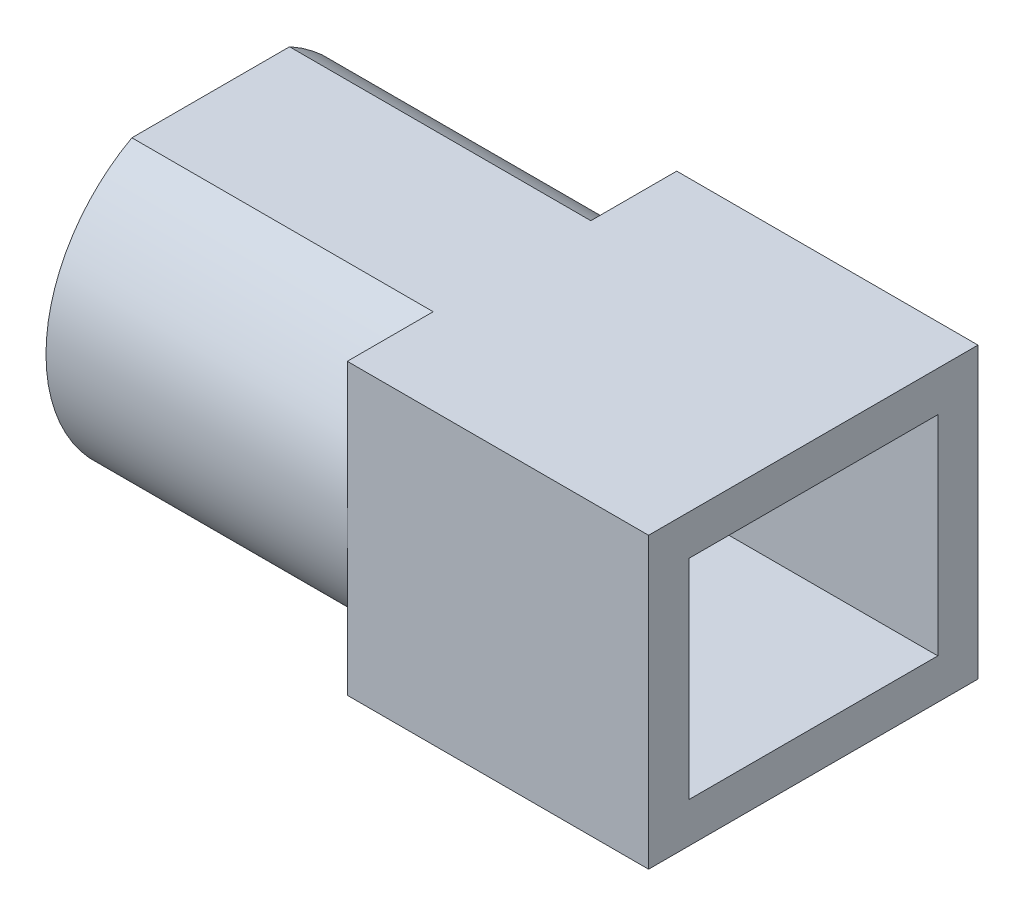
ISO-10303-21;
HEADER;
FILE_DESCRIPTION(('STEP AP214'),'2;1');
FILE_NAME('part.step','',(''),(''),'','','');
FILE_SCHEMA(('AUTOMOTIVE_DESIGN { 1 0 10303 214 1 1 1 1 }'));
ENDSEC;
DATA;
#1=APPLICATION_CONTEXT('core data for automotive mechanical design processes');
#2=APPLICATION_PROTOCOL_DEFINITION('international standard','automotive_design',2000,#1);
#3=PRODUCT_CONTEXT('',#1,'mechanical');
#4=PRODUCT('Part','Part','',(#3));
#5=PRODUCT_RELATED_PRODUCT_CATEGORY('part','',(#4));
#6=PRODUCT_DEFINITION_FORMATION('','',#4);
#7=PRODUCT_DEFINITION_CONTEXT('part definition',#1,'design');
#8=PRODUCT_DEFINITION('design','',#6,#7);
#9=PRODUCT_DEFINITION_SHAPE('','',#8);
#10=(LENGTH_UNIT() NAMED_UNIT(*) SI_UNIT(.MILLI.,.METRE.));
#11=(NAMED_UNIT(*) PLANE_ANGLE_UNIT() SI_UNIT($,.RADIAN.));
#12=(NAMED_UNIT(*) SI_UNIT($,.STERADIAN.) SOLID_ANGLE_UNIT());
#13=UNCERTAINTY_MEASURE_WITH_UNIT(LENGTH_MEASURE(1.E-05),#10,'distance_accuracy_value','');
#14=(GEOMETRIC_REPRESENTATION_CONTEXT(3) GLOBAL_UNCERTAINTY_ASSIGNED_CONTEXT((#13)) GLOBAL_UNIT_ASSIGNED_CONTEXT((#10,
#11,#12)) REPRESENTATION_CONTEXT('',''));
#15=CARTESIAN_POINT('',(0.,0.,0.));
#16=DIRECTION('',(0.,0.,1.));
#17=DIRECTION('',(1.,0.,0.));
#18=AXIS2_PLACEMENT_3D('',#15,#16,#17);
#19=CARTESIAN_POINT('',(30.,0.,0.));
#20=DIRECTION('',(-1.,0.,0.));
#21=DIRECTION('',(0.,0.,1.));
#22=AXIS2_PLACEMENT_3D('',#19,#20,#21);
#23=PLANE('',#22);
#24=DIRECTION('',(0.,0.,-1.));
#25=VECTOR('',#24,1.);
#26=CARTESIAN_POINT('',(30.,7.20000000001164,400000.));
#27=LINE('',#26,#25);
#28=CARTESIAN_POINT('',(30.,7.20000000001164,8.19999999998799));
#29=VERTEX_POINT('',#28);
#30=CARTESIAN_POINT('',(30.,7.19999999999414,3.92428337408047));
#31=VERTEX_POINT('',#30);
#32=EDGE_CURVE('E331',#29,#31,#27,.T.);
#33=ORIENTED_EDGE('',*,*,#32,.T.);
#34=CARTESIAN_POINT('',(30.,0.,0.));
#35=DIRECTION('',(1.,0.,0.));
#36=DIRECTION('',(0.,0.,-1.));
#37=AXIS2_PLACEMENT_3D('',#34,#35,#36);
#38=CIRCLE('',#37,8.2);
#39=CARTESIAN_POINT('',(30.,0.,8.2));
#40=VERTEX_POINT('',#39);
#41=EDGE_CURVE('E55',#31,#40,#38,.T.);
#42=ORIENTED_EDGE('',*,*,#41,.T.);
#43=DIRECTION('',(0.,1.,0.));
#44=VECTOR('',#43,1.);
#45=CARTESIAN_POINT('',(30.,-291592.08,8.19999999998799));
#46=LINE('',#45,#44);
#47=EDGE_CURVE('E325',#40,#29,#46,.T.);
#48=ORIENTED_EDGE('',*,*,#47,.T.);
#49=EDGE_LOOP('',(#33,#42,#48));
#50=FACE_BOUND('',#49,.T.);
#51=ADVANCED_FACE('F43',(#50),#23,.T.);
#52=CARTESIAN_POINT('',(30.,-7.20000000001164,8.19999999998799));
#53=VERTEX_POINT('',#52);
#54=EDGE_CURVE('E326',#53,#40,#46,.T.);
#55=ORIENTED_EDGE('',*,*,#54,.T.);
#56=CARTESIAN_POINT('',(30.,-7.19999999999414,3.92428337408047));
#57=VERTEX_POINT('',#56);
#58=EDGE_CURVE('E11',#40,#57,#38,.T.);
#59=ORIENTED_EDGE('',*,*,#58,.T.);
#60=DIRECTION('',(0.,0.,1.));
#61=VECTOR('',#60,1.);
#62=CARTESIAN_POINT('',(30.,-7.20000000001164,400000.));
#63=LINE('',#62,#61);
#64=EDGE_CURVE('E293',#57,#53,#63,.T.);
#65=ORIENTED_EDGE('',*,*,#64,.T.);
#66=EDGE_LOOP('',(#55,#59,#65));
#67=FACE_BOUND('',#66,.T.);
#68=ADVANCED_FACE('F363',(#67),#23,.T.);
#69=CARTESIAN_POINT('',(30.,-7.20000000001164,-8.19999999998799));
#70=VERTEX_POINT('',#69);
#71=CARTESIAN_POINT('',(30.,-7.20000000001164,-3.92428337409001));
#72=VERTEX_POINT('',#71);
#73=EDGE_CURVE('E321',#70,#72,#63,.T.);
#74=ORIENTED_EDGE('',*,*,#73,.T.);
#75=CARTESIAN_POINT('',(30.,0.,0.));
#76=DIRECTION('',(1.,0.,0.));
#77=DIRECTION('',(0.,0.,-1.));
#78=AXIS2_PLACEMENT_3D('',#75,#76,#77);
#79=CIRCLE('',#78,8.2);
#80=CARTESIAN_POINT('',(30.,0.,-8.2));
#81=VERTEX_POINT('',#80);
#82=EDGE_CURVE('E197',#72,#81,#79,.T.);
#83=ORIENTED_EDGE('',*,*,#82,.T.);
#84=DIRECTION('',(0.,-1.,0.));
#85=VECTOR('',#84,1.);
#86=CARTESIAN_POINT('',(30.,-291592.08,-8.19999999998799));
#87=LINE('',#86,#85);
#88=EDGE_CURVE('E335',#81,#70,#87,.T.);
#89=ORIENTED_EDGE('',*,*,#88,.T.);
#90=EDGE_LOOP('',(#74,#83,#89));
#91=FACE_BOUND('',#90,.T.);
#92=ADVANCED_FACE('F419',(#91),#23,.T.);
#93=CARTESIAN_POINT('',(45.,-7.20000000001164,400000.));
#94=DIRECTION('',(0.,-1.,0.));
#95=DIRECTION('',(0.,0.,-1.));
#96=AXIS2_PLACEMENT_3D('',#93,#94,#95);
#97=PLANE('',#96);
#98=ORIENTED_EDGE('',*,*,#73,.F.);
#99=DIRECTION('',(-1.,0.,0.));
#100=VECTOR('',#99,1.);
#101=CARTESIAN_POINT('',(45.,-7.20000000001164,-8.19999999998799));
#102=LINE('',#101,#100);
#103=CARTESIAN_POINT('',(45.,-7.20000000001164,-8.19999999998799));
#104=VERTEX_POINT('',#103);
#105=EDGE_CURVE('E339',#104,#70,#102,.T.);
#106=ORIENTED_EDGE('',*,*,#105,.F.);
#107=DIRECTION('',(0.,0.,1.));
#108=VECTOR('',#107,1.);
#109=CARTESIAN_POINT('',(45.,-7.20000000001164,400000.));
#110=LINE('',#109,#108);
#111=CARTESIAN_POINT('',(45.,-7.20000000001164,8.19999999998799));
#112=VERTEX_POINT('',#111);
#113=EDGE_CURVE('E304',#104,#112,#110,.T.);
#114=ORIENTED_EDGE('',*,*,#113,.T.);
#115=DIRECTION('',(-1.,0.,0.));
#116=VECTOR('',#115,1.);
#117=CARTESIAN_POINT('',(45.,-7.20000000001164,8.19999999998799));
#118=LINE('',#117,#116);
#119=EDGE_CURVE('E47',#112,#53,#118,.T.);
#120=ORIENTED_EDGE('',*,*,#119,.T.);
#121=ORIENTED_EDGE('',*,*,#64,.F.);
#122=DIRECTION('',(1.,0.,0.));
#123=VECTOR('',#122,1.);
#124=CARTESIAN_POINT('',(15.,-7.19999999999414,3.92428337408047));
#125=LINE('',#124,#123);
#126=CARTESIAN_POINT('',(15.,-7.19999999999414,3.92428337408047));
#127=VERTEX_POINT('',#126);
#128=EDGE_CURVE('E247',#127,#57,#125,.T.);
#129=ORIENTED_EDGE('',*,*,#128,.F.);
#130=DIRECTION('',(0.,0.,1.));
#131=VECTOR('',#130,1.);
#132=CARTESIAN_POINT('',(15.,-7.20000000001164,400000.));
#133=LINE('',#132,#131);
#134=CARTESIAN_POINT('',(15.,-7.20000000001164,-3.92428337409001));
#135=VERTEX_POINT('',#134);
#136=EDGE_CURVE('E232',#135,#127,#133,.T.);
#137=ORIENTED_EDGE('',*,*,#136,.F.);
#138=DIRECTION('',(1.,0.,0.));
#139=VECTOR('',#138,1.);
#140=CARTESIAN_POINT('',(15.,-7.20000000001164,-3.92428337409001));
#141=LINE('',#140,#139);
#142=EDGE_CURVE('E250',#135,#72,#141,.T.);
#143=ORIENTED_EDGE('',*,*,#142,.T.);
#144=EDGE_LOOP('',(#98,#106,#114,#120,#121,#129,#137,#143));
#145=FACE_BOUND('',#144,.T.);
#146=ADVANCED_FACE('F45',(#145),#97,.T.);
#147=CARTESIAN_POINT('',(45.,-291592.08,-8.19999999998799));
#148=DIRECTION('',(0.,0.,-1.));
#149=DIRECTION('',(-1.,0.,0.));
#150=AXIS2_PLACEMENT_3D('',#147,#148,#149);
#151=PLANE('',#150);
#152=CARTESIAN_POINT('',(30.,7.20000000001164,-8.19999999998799));
#153=VERTEX_POINT('',#152);
#154=EDGE_CURVE('E309',#153,#81,#87,.T.);
#155=ORIENTED_EDGE('',*,*,#154,.F.);
#156=DIRECTION('',(-1.,0.,0.));
#157=VECTOR('',#156,1.);
#158=CARTESIAN_POINT('',(45.,7.20000000001164,-8.19999999998799));
#159=LINE('',#158,#157);
#160=CARTESIAN_POINT('',(45.,7.20000000001164,-8.19999999998799));
#161=VERTEX_POINT('',#160);
#162=EDGE_CURVE('E343',#161,#153,#159,.T.);
#163=ORIENTED_EDGE('',*,*,#162,.F.);
#164=DIRECTION('',(0.,-1.,0.));
#165=VECTOR('',#164,1.);
#166=CARTESIAN_POINT('',(45.,-291592.08,-8.19999999998799));
#167=LINE('',#166,#165);
#168=EDGE_CURVE('E317',#161,#104,#167,.T.);
#169=ORIENTED_EDGE('',*,*,#168,.T.);
#170=ORIENTED_EDGE('',*,*,#105,.T.);
#171=ORIENTED_EDGE('',*,*,#88,.F.);
#172=EDGE_LOOP('',(#155,#163,#169,#170,#171));
#173=FACE_BOUND('',#172,.T.);
#174=ADVANCED_FACE('F434',(#173),#151,.T.);
#175=CARTESIAN_POINT('',(45.,7.20000000001164,400000.));
#176=DIRECTION('',(0.,1.,0.));
#177=DIRECTION('',(0.,0.,1.));
#178=AXIS2_PLACEMENT_3D('',#175,#176,#177);
#179=PLANE('',#178);
#180=ORIENTED_EDGE('',*,*,#32,.F.);
#181=DIRECTION('',(-1.,0.,0.));
#182=VECTOR('',#181,1.);
#183=CARTESIAN_POINT('',(45.,7.20000000001164,8.19999999998799));
#184=LINE('',#183,#182);
#185=CARTESIAN_POINT('',(45.,7.20000000001164,8.19999999998799));
#186=VERTEX_POINT('',#185);
#187=EDGE_CURVE('E346',#186,#29,#184,.T.);
#188=ORIENTED_EDGE('',*,*,#187,.F.);
#189=DIRECTION('',(0.,0.,-1.));
#190=VECTOR('',#189,1.);
#191=CARTESIAN_POINT('',(45.,7.20000000001164,400000.));
#192=LINE('',#191,#190);
#193=EDGE_CURVE('E313',#186,#161,#192,.T.);
#194=ORIENTED_EDGE('',*,*,#193,.T.);
#195=ORIENTED_EDGE('',*,*,#162,.T.);
#196=CARTESIAN_POINT('',(30.,7.20000000001164,-3.92428337404836));
#197=VERTEX_POINT('',#196);
#198=EDGE_CURVE('E330',#197,#153,#27,.T.);
#199=ORIENTED_EDGE('',*,*,#198,.F.);
#200=DIRECTION('',(1.,0.,0.));
#201=VECTOR('',#200,1.);
#202=CARTESIAN_POINT('',(15.,7.19999999999414,-3.92428337408047));
#203=LINE('',#202,#201);
#204=CARTESIAN_POINT('',(15.,7.19999999999414,-3.92428337408047));
#205=VERTEX_POINT('',#204);
#206=EDGE_CURVE('E62',#205,#197,#203,.T.);
#207=ORIENTED_EDGE('',*,*,#206,.F.);
#208=DIRECTION('',(0.,0.,-1.));
#209=VECTOR('',#208,1.);
#210=CARTESIAN_POINT('',(15.,7.20000000001164,400000.));
#211=LINE('',#210,#209);
#212=CARTESIAN_POINT('',(15.,7.19999999999414,3.92428337408047));
#213=VERTEX_POINT('',#212);
#214=EDGE_CURVE('E226',#213,#205,#211,.T.);
#215=ORIENTED_EDGE('',*,*,#214,.F.);
#216=DIRECTION('',(1.,0.,0.));
#217=VECTOR('',#216,1.);
#218=CARTESIAN_POINT('',(15.,7.19999999999414,3.92428337408047));
#219=LINE('',#218,#217);
#220=EDGE_CURVE('E239',#213,#31,#219,.T.);
#221=ORIENTED_EDGE('',*,*,#220,.T.);
#222=EDGE_LOOP('',(#180,#188,#194,#195,#199,#207,#215,#221));
#223=FACE_BOUND('',#222,.T.);
#224=ADVANCED_FACE('F443',(#223),#179,.T.);
#225=CARTESIAN_POINT('',(45.,-291592.08,8.19999999998799));
#226=DIRECTION('',(0.,0.,1.));
#227=DIRECTION('',(1.,0.,0.));
#228=AXIS2_PLACEMENT_3D('',#225,#226,#227);
#229=PLANE('',#228);
#230=ORIENTED_EDGE('',*,*,#54,.F.);
#231=ORIENTED_EDGE('',*,*,#119,.F.);
#232=DIRECTION('',(0.,1.,0.));
#233=VECTOR('',#232,1.);
#234=CARTESIAN_POINT('',(45.,-291592.08,8.19999999998799));
#235=LINE('',#234,#233);
#236=EDGE_CURVE('E308',#112,#186,#235,.T.);
#237=ORIENTED_EDGE('',*,*,#236,.T.);
#238=ORIENTED_EDGE('',*,*,#187,.T.);
#239=ORIENTED_EDGE('',*,*,#47,.F.);
#240=EDGE_LOOP('',(#230,#231,#237,#238,#239));
#241=FACE_BOUND('',#240,.T.);
#242=ADVANCED_FACE('F361',(#241),#229,.T.);
#243=CARTESIAN_POINT('',(45.,0.,0.));
#244=DIRECTION('',(-1.,0.,0.));
#245=DIRECTION('',(0.,0.,1.));
#246=AXIS2_PLACEMENT_3D('',#243,#244,#245);
#247=PLANE('',#246);
#248=DIRECTION('',(0.,1.,0.));
#249=VECTOR('',#248,1.);
#250=CARTESIAN_POINT('',(45.,-291592.08,6.1999999999216));
#251=LINE('',#250,#249);
#252=CARTESIAN_POINT('',(45.,-5.20000000000209,6.19999999997024));
#253=VERTEX_POINT('',#252);
#254=CARTESIAN_POINT('',(45.,5.20000000000209,6.19999999997024));
#255=VERTEX_POINT('',#254);
#256=EDGE_CURVE('E267',#253,#255,#251,.T.);
#257=ORIENTED_EDGE('',*,*,#256,.T.);
#258=DIRECTION('',(0.,0.,-1.));
#259=VECTOR('',#258,1.);
#260=CARTESIAN_POINT('',(45.,5.20000000011578,400000.));
#261=LINE('',#260,#259);
#262=CARTESIAN_POINT('',(45.,5.20000000000209,-6.19999999996233));
#263=VERTEX_POINT('',#262);
#264=EDGE_CURVE('E256',#255,#263,#261,.T.);
#265=ORIENTED_EDGE('',*,*,#264,.T.);
#266=DIRECTION('',(0.,-1.,0.));
#267=VECTOR('',#266,1.);
#268=CARTESIAN_POINT('',(45.,-291592.08,-6.20000000003529));
#269=LINE('',#268,#267);
#270=CARTESIAN_POINT('',(45.,-5.20000000000209,-6.19999999996233));
#271=VERTEX_POINT('',#270);
#272=EDGE_CURVE('E260',#263,#271,#269,.T.);
#273=ORIENTED_EDGE('',*,*,#272,.T.);
#274=DIRECTION('',(0.,0.,1.));
#275=VECTOR('',#274,1.);
#276=CARTESIAN_POINT('',(45.,-5.20000000000209,400000.));
#277=LINE('',#276,#275);
#278=EDGE_CURVE('E70',#271,#253,#277,.T.);
#279=ORIENTED_EDGE('',*,*,#278,.T.);
#280=EDGE_LOOP('',(#257,#265,#273,#279));
#281=FACE_BOUND('',#280,.T.);
#282=ORIENTED_EDGE('',*,*,#113,.F.);
#283=ORIENTED_EDGE('',*,*,#168,.F.);
#284=ORIENTED_EDGE('',*,*,#193,.F.);
#285=ORIENTED_EDGE('',*,*,#236,.F.);
#286=EDGE_LOOP('',(#282,#283,#284,#285));
#287=FACE_BOUND('',#286,.T.);
#288=ADVANCED_FACE('F383',(#281,#287),#247,.F.);
#289=ORIENTED_EDGE('',*,*,#154,.T.);
#290=EDGE_CURVE('E53',#81,#197,#79,.T.);
#291=ORIENTED_EDGE('',*,*,#290,.T.);
#292=ORIENTED_EDGE('',*,*,#198,.T.);
#293=EDGE_LOOP('',(#289,#291,#292));
#294=FACE_BOUND('',#293,.T.);
#295=ADVANCED_FACE('F415',(#294),#23,.T.);
#296=CARTESIAN_POINT('',(45.,5.20000000011578,400000.));
#297=DIRECTION('',(0.,1.,0.));
#298=DIRECTION('',(0.,0.,1.));
#299=AXIS2_PLACEMENT_3D('',#296,#297,#298);
#300=PLANE('',#299);
#301=DIRECTION('',(0.,0.,-1.));
#302=VECTOR('',#301,1.);
#303=CARTESIAN_POINT('',(30.,5.20000000011578,400000.));
#304=LINE('',#303,#302);
#305=CARTESIAN_POINT('',(30.,5.20000000000209,6.19999999997024));
#306=VERTEX_POINT('',#305);
#307=CARTESIAN_POINT('',(30.,5.20000000000209,3.37638860327161));
#308=VERTEX_POINT('',#307);
#309=EDGE_CURVE('E272',#306,#308,#304,.T.);
#310=ORIENTED_EDGE('',*,*,#309,.T.);
#311=DIRECTION('',(1.,0.,0.));
#312=VECTOR('',#311,1.);
#313=CARTESIAN_POINT('',(15.,5.20000000000209,3.37638860327161));
#314=LINE('',#313,#312);
#315=CARTESIAN_POINT('',(15.,5.20000000000209,3.37638860327161));
#316=VERTEX_POINT('',#315);
#317=EDGE_CURVE('E198',#316,#308,#314,.T.);
#318=ORIENTED_EDGE('',*,*,#317,.F.);
#319=DIRECTION('',(0.,0.,-1.));
#320=VECTOR('',#319,1.);
#321=CARTESIAN_POINT('',(15.,5.20000000000209,400000.));
#322=LINE('',#321,#320);
#323=CARTESIAN_POINT('',(15.,5.20000000000613,-3.37638860321739));
#324=VERTEX_POINT('',#323);
#325=EDGE_CURVE('E202',#316,#324,#322,.T.);
#326=ORIENTED_EDGE('',*,*,#325,.T.);
#327=DIRECTION('',(1.,0.,0.));
#328=VECTOR('',#327,1.);
#329=CARTESIAN_POINT('',(15.,5.20000000000613,-3.37638860321739));
#330=LINE('',#329,#328);
#331=CARTESIAN_POINT('',(30.,5.20000000000613,-3.37638860321739));
#332=VERTEX_POINT('',#331);
#333=EDGE_CURVE('E220',#324,#332,#330,.T.);
#334=ORIENTED_EDGE('',*,*,#333,.T.);
#335=CARTESIAN_POINT('',(30.,5.20000000000209,-6.19999999996233));
#336=VERTEX_POINT('',#335);
#337=EDGE_CURVE('E255',#332,#336,#304,.T.);
#338=ORIENTED_EDGE('',*,*,#337,.T.);
#339=DIRECTION('',(-1.,0.,0.));
#340=VECTOR('',#339,1.);
#341=CARTESIAN_POINT('',(45.,5.20000000000209,-6.19999999996233));
#342=LINE('',#341,#340);
#343=EDGE_CURVE('E271',#263,#336,#342,.T.);
#344=ORIENTED_EDGE('',*,*,#343,.F.);
#345=ORIENTED_EDGE('',*,*,#264,.F.);
#346=DIRECTION('',(-1.,0.,0.));
#347=VECTOR('',#346,1.);
#348=CARTESIAN_POINT('',(45.,5.20000000000209,6.19999999997024));
#349=LINE('',#348,#347);
#350=EDGE_CURVE('E289',#255,#306,#349,.T.);
#351=ORIENTED_EDGE('',*,*,#350,.T.);
#352=EDGE_LOOP('',(#310,#318,#326,#334,#338,#344,#345,#351));
#353=FACE_BOUND('',#352,.T.);
#354=ADVANCED_FACE('F374',(#353),#300,.F.);
#355=CARTESIAN_POINT('',(45.,-291592.08,6.1999999999216));
#356=DIRECTION('',(0.,0.,1.));
#357=DIRECTION('',(0.,-1.,0.));
#358=AXIS2_PLACEMENT_3D('',#355,#356,#357);
#359=PLANE('',#358);
#360=DIRECTION('',(0.,1.,0.));
#361=VECTOR('',#360,1.);
#362=CARTESIAN_POINT('',(30.,-291592.08,6.1999999999216));
#363=LINE('',#362,#361);
#364=CARTESIAN_POINT('',(30.,-5.20000000000209,6.19999999997024));
#365=VERTEX_POINT('',#364);
#366=CARTESIAN_POINT('',(30.,0.,6.2));
#367=VERTEX_POINT('',#366);
#368=EDGE_CURVE('E261',#365,#367,#363,.T.);
#369=ORIENTED_EDGE('',*,*,#368,.T.);
#370=EDGE_CURVE('E285',#367,#306,#363,.T.);
#371=ORIENTED_EDGE('',*,*,#370,.T.);
#372=ORIENTED_EDGE('',*,*,#350,.F.);
#373=ORIENTED_EDGE('',*,*,#256,.F.);
#374=DIRECTION('',(-1.,0.,0.));
#375=VECTOR('',#374,1.);
#376=CARTESIAN_POINT('',(45.,-5.20000000000209,6.19999999997024));
#377=LINE('',#376,#375);
#378=EDGE_CURVE('E294',#253,#365,#377,.T.);
#379=ORIENTED_EDGE('',*,*,#378,.T.);
#380=EDGE_LOOP('',(#369,#371,#372,#373,#379));
#381=FACE_BOUND('',#380,.T.);
#382=ADVANCED_FACE('F387',(#381),#359,.F.);
#383=CARTESIAN_POINT('',(45.,-5.20000000000209,400000.));
#384=DIRECTION('',(0.,-1.,0.));
#385=DIRECTION('',(0.,0.,-1.));
#386=AXIS2_PLACEMENT_3D('',#383,#384,#385);
#387=PLANE('',#386);
#388=DIRECTION('',(0.,0.,1.));
#389=VECTOR('',#388,1.);
#390=CARTESIAN_POINT('',(30.,-5.20000000000209,400000.));
#391=LINE('',#390,#389);
#392=CARTESIAN_POINT('',(30.,-5.20000000000209,-6.19999999997844));
#393=VERTEX_POINT('',#392);
#394=CARTESIAN_POINT('',(30.,-5.20000000000613,-3.37638860321738));
#395=VERTEX_POINT('',#394);
#396=EDGE_CURVE('E282',#393,#395,#391,.T.);
#397=ORIENTED_EDGE('',*,*,#396,.T.);
#398=DIRECTION('',(1.,0.,0.));
#399=VECTOR('',#398,1.);
#400=CARTESIAN_POINT('',(15.,-5.20000000000613,-3.37638860321738));
#401=LINE('',#400,#399);
#402=CARTESIAN_POINT('',(15.,-5.20000000000613,-3.37638860321738));
#403=VERTEX_POINT('',#402);
#404=EDGE_CURVE('E179',#403,#395,#401,.T.);
#405=ORIENTED_EDGE('',*,*,#404,.F.);
#406=DIRECTION('',(0.,0.,1.));
#407=VECTOR('',#406,1.);
#408=CARTESIAN_POINT('',(15.,-5.20000000000209,400000.));
#409=LINE('',#408,#407);
#410=CARTESIAN_POINT('',(15.,-5.20000000000613,3.37638860321738));
#411=VERTEX_POINT('',#410);
#412=EDGE_CURVE('E173',#403,#411,#409,.T.);
#413=ORIENTED_EDGE('',*,*,#412,.T.);
#414=DIRECTION('',(1.,0.,0.));
#415=VECTOR('',#414,1.);
#416=CARTESIAN_POINT('',(15.,-5.20000000000613,3.37638860321738));
#417=LINE('',#416,#415);
#418=CARTESIAN_POINT('',(30.,-5.20000000000613,3.37638860321738));
#419=VERTEX_POINT('',#418);
#420=EDGE_CURVE('E178',#411,#419,#417,.T.);
#421=ORIENTED_EDGE('',*,*,#420,.T.);
#422=EDGE_CURVE('E281',#419,#365,#391,.T.);
#423=ORIENTED_EDGE('',*,*,#422,.T.);
#424=ORIENTED_EDGE('',*,*,#378,.F.);
#425=ORIENTED_EDGE('',*,*,#278,.F.);
#426=DIRECTION('',(-1.,0.,0.));
#427=VECTOR('',#426,1.);
#428=CARTESIAN_POINT('',(45.,-5.20000000000209,-6.19999999997844));
#429=LINE('',#428,#427);
#430=EDGE_CURVE('E298',#271,#393,#429,.T.);
#431=ORIENTED_EDGE('',*,*,#430,.T.);
#432=EDGE_LOOP('',(#397,#405,#413,#421,#423,#424,#425,#431));
#433=FACE_BOUND('',#432,.T.);
#434=ADVANCED_FACE('F176',(#433),#387,.F.);
#435=CARTESIAN_POINT('',(45.,-291592.08,-6.20000000003529));
#436=DIRECTION('',(0.,0.,-1.));
#437=DIRECTION('',(0.,1.,0.));
#438=AXIS2_PLACEMENT_3D('',#435,#436,#437);
#439=PLANE('',#438);
#440=DIRECTION('',(0.,-1.,0.));
#441=VECTOR('',#440,1.);
#442=CARTESIAN_POINT('',(30.,-291592.08,-6.20000000003529));
#443=LINE('',#442,#441);
#444=CARTESIAN_POINT('',(30.,0.,-6.2));
#445=VERTEX_POINT('',#444);
#446=EDGE_CURVE('E277',#336,#445,#443,.T.);
#447=ORIENTED_EDGE('',*,*,#446,.T.);
#448=EDGE_CURVE('E276',#445,#393,#443,.T.);
#449=ORIENTED_EDGE('',*,*,#448,.T.);
#450=ORIENTED_EDGE('',*,*,#430,.F.);
#451=ORIENTED_EDGE('',*,*,#272,.F.);
#452=ORIENTED_EDGE('',*,*,#343,.T.);
#453=EDGE_LOOP('',(#447,#449,#450,#451,#452));
#454=FACE_BOUND('',#453,.T.);
#455=ADVANCED_FACE('F381',(#454),#439,.F.);
#456=CARTESIAN_POINT('',(30.,0.,0.));
#457=DIRECTION('',(1.,0.,0.));
#458=DIRECTION('',(0.,0.,-1.));
#459=AXIS2_PLACEMENT_3D('',#456,#457,#458);
#460=PLANE('',#459);
#461=ORIENTED_EDGE('',*,*,#309,.F.);
#462=ORIENTED_EDGE('',*,*,#370,.F.);
#463=CARTESIAN_POINT('',(30.,0.,0.));
#464=DIRECTION('',(1.,0.,0.));
#465=DIRECTION('',(0.,0.,-1.));
#466=AXIS2_PLACEMENT_3D('',#463,#464,#465);
#467=CIRCLE('',#466,6.2);
#468=EDGE_CURVE('E211',#308,#367,#467,.T.);
#469=ORIENTED_EDGE('',*,*,#468,.F.);
#470=EDGE_LOOP('',(#461,#462,#469));
#471=FACE_BOUND('',#470,.T.);
#472=ADVANCED_FACE('F390',(#471),#460,.T.);
#473=ORIENTED_EDGE('',*,*,#368,.F.);
#474=ORIENTED_EDGE('',*,*,#422,.F.);
#475=EDGE_CURVE('E195',#367,#419,#467,.T.);
#476=ORIENTED_EDGE('',*,*,#475,.F.);
#477=EDGE_LOOP('',(#473,#474,#476));
#478=FACE_BOUND('',#477,.T.);
#479=ADVANCED_FACE('F392',(#478),#460,.T.);
#480=ORIENTED_EDGE('',*,*,#337,.F.);
#481=CARTESIAN_POINT('',(30.,0.,0.));
#482=DIRECTION('',(1.,0.,0.));
#483=DIRECTION('',(0.,0.,-1.));
#484=AXIS2_PLACEMENT_3D('',#481,#482,#483);
#485=CIRCLE('',#484,6.2);
#486=EDGE_CURVE('E214',#445,#332,#485,.T.);
#487=ORIENTED_EDGE('',*,*,#486,.F.);
#488=ORIENTED_EDGE('',*,*,#446,.F.);
#489=EDGE_LOOP('',(#480,#487,#488));
#490=FACE_BOUND('',#489,.T.);
#491=ADVANCED_FACE('F398',(#490),#460,.T.);
#492=CARTESIAN_POINT('',(15.,0.,0.));
#493=DIRECTION('',(1.,0.,0.));
#494=DIRECTION('',(0.,0.,-1.));
#495=AXIS2_PLACEMENT_3D('',#492,#493,#494);
#496=PLANE('',#495);
#497=ORIENTED_EDGE('',*,*,#214,.T.);
#498=CARTESIAN_POINT('',(15.,0.,0.));
#499=DIRECTION('',(1.,0.,0.));
#500=DIRECTION('',(0.,0.,-1.));
#501=AXIS2_PLACEMENT_3D('',#498,#499,#500);
#502=CIRCLE('',#501,8.2);
#503=EDGE_CURVE('E229',#135,#205,#502,.T.);
#504=ORIENTED_EDGE('',*,*,#503,.F.);
#505=ORIENTED_EDGE('',*,*,#136,.T.);
#506=CARTESIAN_POINT('',(15.,0.,0.));
#507=DIRECTION('',(1.,0.,0.));
#508=DIRECTION('',(0.,0.,-1.));
#509=AXIS2_PLACEMENT_3D('',#506,#507,#508);
#510=CIRCLE('',#509,8.2);
#511=EDGE_CURVE('E235',#213,#127,#510,.T.);
#512=ORIENTED_EDGE('',*,*,#511,.F.);
#513=EDGE_LOOP('',(#497,#504,#505,#512));
#514=FACE_BOUND('',#513,.T.);
#515=ORIENTED_EDGE('',*,*,#412,.F.);
#516=CARTESIAN_POINT('',(15.,0.,0.));
#517=DIRECTION('',(1.,0.,0.));
#518=DIRECTION('',(0.,0.,-1.));
#519=AXIS2_PLACEMENT_3D('',#516,#517,#518);
#520=CIRCLE('',#519,6.2);
#521=EDGE_CURVE('E206',#403,#324,#520,.T.);
#522=ORIENTED_EDGE('',*,*,#521,.T.);
#523=ORIENTED_EDGE('',*,*,#325,.F.);
#524=CARTESIAN_POINT('',(15.,0.,0.));
#525=DIRECTION('',(1.,0.,0.));
#526=DIRECTION('',(0.,0.,-1.));
#527=AXIS2_PLACEMENT_3D('',#524,#525,#526);
#528=CIRCLE('',#527,6.2);
#529=EDGE_CURVE('E185',#316,#411,#528,.T.);
#530=ORIENTED_EDGE('',*,*,#529,.T.);
#531=EDGE_LOOP('',(#515,#522,#523,#530));
#532=FACE_BOUND('',#531,.T.);
#533=ADVANCED_FACE('F200',(#514,#532),#496,.F.);
#534=ORIENTED_EDGE('',*,*,#396,.F.);
#535=ORIENTED_EDGE('',*,*,#448,.F.);
#536=EDGE_CURVE('E186',#395,#445,#485,.T.);
#537=ORIENTED_EDGE('',*,*,#536,.F.);
#538=EDGE_LOOP('',(#534,#535,#537));
#539=FACE_BOUND('',#538,.T.);
#540=ADVANCED_FACE('F401',(#539),#460,.T.);
#541=CARTESIAN_POINT('',(15.,0.,0.));
#542=DIRECTION('',(1.,0.,0.));
#543=DIRECTION('',(0.,0.,-1.));
#544=AXIS2_PLACEMENT_3D('',#541,#542,#543);
#545=CYLINDRICAL_SURFACE('',#544,8.2);
#546=ORIENTED_EDGE('',*,*,#82,.F.);
#547=ORIENTED_EDGE('',*,*,#142,.F.);
#548=ORIENTED_EDGE('',*,*,#503,.T.);
#549=ORIENTED_EDGE('',*,*,#206,.T.);
#550=ORIENTED_EDGE('',*,*,#290,.F.);
#551=EDGE_LOOP('',(#546,#547,#548,#549,#550));
#552=FACE_BOUND('',#551,.T.);
#553=ADVANCED_FACE('F410',(#552),#545,.T.);
#554=CARTESIAN_POINT('',(15.,0.,0.));
#555=DIRECTION('',(1.,0.,0.));
#556=DIRECTION('',(0.,0.,-1.));
#557=AXIS2_PLACEMENT_3D('',#554,#555,#556);
#558=CYLINDRICAL_SURFACE('',#557,8.2);
#559=ORIENTED_EDGE('',*,*,#41,.F.);
#560=ORIENTED_EDGE('',*,*,#220,.F.);
#561=ORIENTED_EDGE('',*,*,#511,.T.);
#562=ORIENTED_EDGE('',*,*,#128,.T.);
#563=ORIENTED_EDGE('',*,*,#58,.F.);
#564=EDGE_LOOP('',(#559,#560,#561,#562,#563));
#565=FACE_BOUND('',#564,.T.);
#566=ADVANCED_FACE('F449',(#565),#558,.T.);
#567=CARTESIAN_POINT('',(15.,0.,0.));
#568=DIRECTION('',(1.,0.,0.));
#569=DIRECTION('',(0.,0.,-1.));
#570=AXIS2_PLACEMENT_3D('',#567,#568,#569);
#571=CYLINDRICAL_SURFACE('',#570,6.2);
#572=ORIENTED_EDGE('',*,*,#468,.T.);
#573=ORIENTED_EDGE('',*,*,#475,.T.);
#574=ORIENTED_EDGE('',*,*,#420,.F.);
#575=ORIENTED_EDGE('',*,*,#529,.F.);
#576=ORIENTED_EDGE('',*,*,#317,.T.);
#577=EDGE_LOOP('',(#572,#573,#574,#575,#576));
#578=FACE_BOUND('',#577,.T.);
#579=ADVANCED_FACE('F192',(#578),#571,.F.);
#580=CARTESIAN_POINT('',(15.,0.,0.));
#581=DIRECTION('',(1.,0.,0.));
#582=DIRECTION('',(0.,0.,-1.));
#583=AXIS2_PLACEMENT_3D('',#580,#581,#582);
#584=CYLINDRICAL_SURFACE('',#583,6.2);
#585=ORIENTED_EDGE('',*,*,#536,.T.);
#586=ORIENTED_EDGE('',*,*,#486,.T.);
#587=ORIENTED_EDGE('',*,*,#333,.F.);
#588=ORIENTED_EDGE('',*,*,#521,.F.);
#589=ORIENTED_EDGE('',*,*,#404,.T.);
#590=EDGE_LOOP('',(#585,#586,#587,#588,#589));
#591=FACE_BOUND('',#590,.T.);
#592=ADVANCED_FACE('F395',(#591),#584,.F.);
#593=CLOSED_SHELL('',(#51,#68,#92,#146,#174,#224,#242,#288,#295,#354,#382,#434,#455,#472,#479,
#491,#533,#540,#553,#566,#579,#592));
#594=MANIFOLD_SOLID_BREP('B2',#593);
#595=ADVANCED_BREP_SHAPE_REPRESENTATION('',(#18,#594),#14);
#596=SHAPE_DEFINITION_REPRESENTATION(#9,#595);
ENDSEC;
END-ISO-10303-21;
